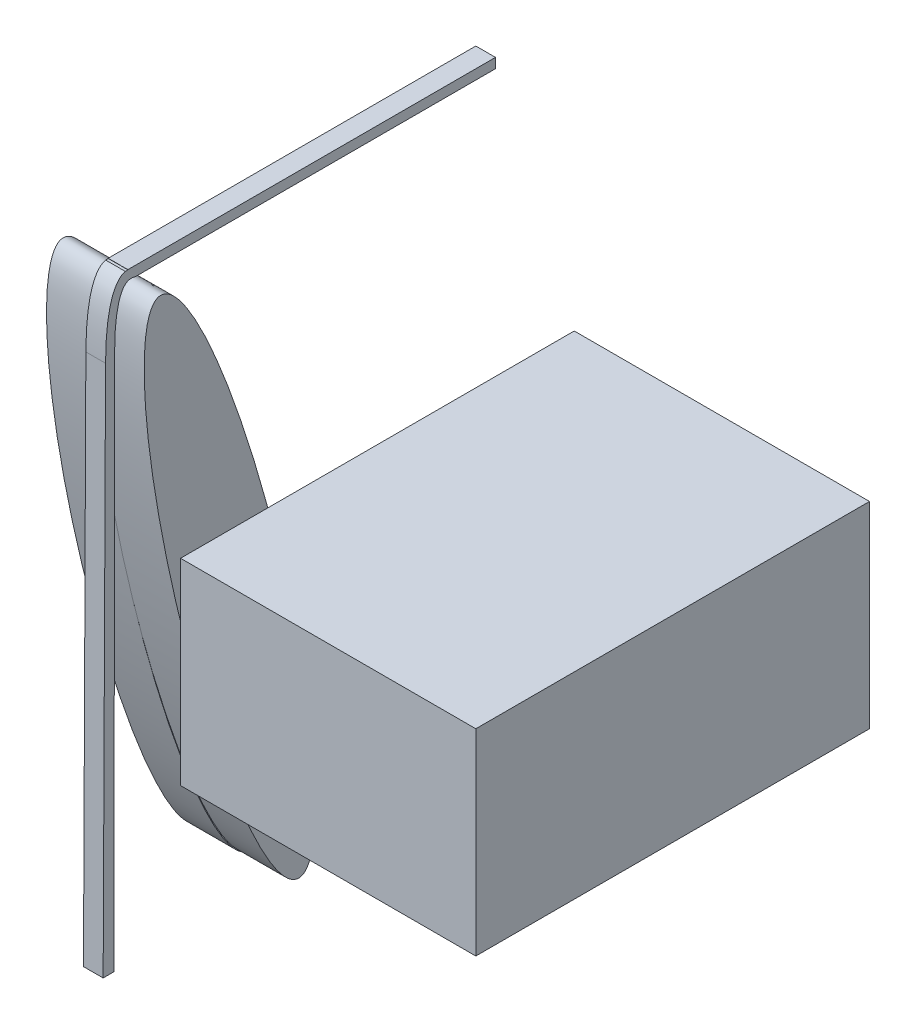
ISO-10303-21;
HEADER;
FILE_DESCRIPTION(('STEP AP214'),'2;1');
FILE_NAME('part.step','',(''),(''),'','','');
FILE_SCHEMA(('AUTOMOTIVE_DESIGN { 1 0 10303 214 1 1 1 1 }'));
ENDSEC;
DATA;
#1=APPLICATION_CONTEXT('core data for automotive mechanical design processes');
#2=APPLICATION_PROTOCOL_DEFINITION('international standard','automotive_design',2000,#1);
#3=PRODUCT_CONTEXT('',#1,'mechanical');
#4=PRODUCT('Part','Part','',(#3));
#5=PRODUCT_RELATED_PRODUCT_CATEGORY('part','',(#4));
#6=PRODUCT_DEFINITION_FORMATION('','',#4);
#7=PRODUCT_DEFINITION_CONTEXT('part definition',#1,'design');
#8=PRODUCT_DEFINITION('design','',#6,#7);
#9=PRODUCT_DEFINITION_SHAPE('','',#8);
#10=(LENGTH_UNIT() NAMED_UNIT(*) SI_UNIT(.MILLI.,.METRE.));
#11=(NAMED_UNIT(*) PLANE_ANGLE_UNIT() SI_UNIT($,.RADIAN.));
#12=(NAMED_UNIT(*) SI_UNIT($,.STERADIAN.) SOLID_ANGLE_UNIT());
#13=UNCERTAINTY_MEASURE_WITH_UNIT(LENGTH_MEASURE(1.E-05),#10,'distance_accuracy_value','');
#14=(GEOMETRIC_REPRESENTATION_CONTEXT(3) GLOBAL_UNCERTAINTY_ASSIGNED_CONTEXT((#13)) GLOBAL_UNIT_ASSIGNED_CONTEXT((#10,
#11,#12)) REPRESENTATION_CONTEXT('',''));
#15=CARTESIAN_POINT('',(0.,0.,0.));
#16=DIRECTION('',(0.,0.,1.));
#17=DIRECTION('',(1.,0.,0.));
#18=AXIS2_PLACEMENT_3D('',#15,#16,#17);
#19=CARTESIAN_POINT('',(-10.,10.,30.));
#20=DIRECTION('',(-1.,0.,0.));
#21=DIRECTION('',(0.,0.,1.));
#22=AXIS2_PLACEMENT_3D('',#19,#20,#21);
#23=PLANE('',#22);
#24=CARTESIAN_POINT('',(-10.,10.,30.));
#25=DIRECTION('',(-1.,0.,0.));
#26=DIRECTION('',(0.,-0.971398766942105,-0.237454070471235));
#27=AXIS2_PLACEMENT_3D('',#24,#25,#26);
#28=ELLIPSE('',#27,29.9945475637786,5.00002524983495);
#29=CARTESIAN_POINT('',(-10.,8.81272365196809,34.8570183623691));
#30=VERTEX_POINT('',#29);
#31=CARTESIAN_POINT('',(-10.,39.0746483582424,36.5030729096314));
#32=VERTEX_POINT('',#31);
#33=EDGE_CURVE('E11',#30,#32,#28,.T.);
#34=ORIENTED_EDGE('',*,*,#33,.F.);
#35=CARTESIAN_POINT('',(-10.,10.,30.));
#36=DIRECTION('',(-1.,0.,0.));
#37=DIRECTION('',(0.,0.970628381176253,0.240583760165074));
#38=AXIS2_PLACEMENT_3D('',#35,#36,#37);
#39=ELLIPSE('',#38,30.,5.);
#40=CARTESIAN_POINT('',(-10.,33.5140158510238,38.697434300692));
#41=VERTEX_POINT('',#40);
#42=EDGE_CURVE('E171',#30,#41,#39,.T.);
#43=ORIENTED_EDGE('',*,*,#42,.T.);
#44=DIRECTION('',(0.,-0.999999229372091,0.00124147300618938));
#45=VECTOR('',#44,1.);
#46=CARTESIAN_POINT('',(-10.,0.0480934448613429,38.7389879275843));
#47=LINE('',#46,#45);
#48=CARTESIAN_POINT('',(-10.,-21.,38.7651185875649));
#49=VERTEX_POINT('',#48);
#50=EDGE_CURVE('E188',#41,#49,#47,.T.);
#51=ORIENTED_EDGE('',*,*,#50,.T.);
#52=DIRECTION('',(0.,0.,1.));
#53=VECTOR('',#52,1.);
#54=CARTESIAN_POINT('',(-10.,-20.9999999999999,0.));
#55=LINE('',#54,#53);
#56=CARTESIAN_POINT('',(-10.,-21.,39.8624684707727));
#57=VERTEX_POINT('',#56);
#58=EDGE_CURVE('E409',#49,#57,#55,.T.);
#59=ORIENTED_EDGE('',*,*,#58,.T.);
#60=DIRECTION('',(0.,-0.999989834259744,0.00450903284201434));
#61=VECTOR('',#60,1.);
#62=CARTESIAN_POINT('',(-10.,0.179312393375753,39.7669692847997));
#63=LINE('',#62,#61);
#64=CARTESIAN_POINT('',(-10.,32.9672969363152,39.6191256827325));
#65=VERTEX_POINT('',#64);
#66=EDGE_CURVE('E405',#65,#57,#63,.T.);
#67=ORIENTED_EDGE('',*,*,#66,.F.);
#68=CARTESIAN_POINT('',(-10.,9.96074716305292,30.1584062384746));
#69=DIRECTION('',(-1.,0.,0.));
#70=DIRECTION('',(0.,0.970643196282759,0.240523981153624));
#71=AXIS2_PLACEMENT_3D('',#68,#69,#70);
#72=ELLIPSE('',#71,31.,6.);
#73=CARTESIAN_POINT('',(-10.,40.0506862478184,37.6146496542369));
#74=VERTEX_POINT('',#73);
#75=EDGE_CURVE('E402',#65,#74,#72,.T.);
#76=ORIENTED_EDGE('',*,*,#75,.T.);
#77=DIRECTION('',(0.,-0.000637041838274439,0.999999797088828));
#78=VECTOR('',#77,1.);
#79=CARTESIAN_POINT('',(-10.,40.0746320950563,0.025529222478171));
#80=LINE('',#79,#78);
#81=CARTESIAN_POINT('',(-10.,40.0508557961112,37.3485003244142));
#82=VERTEX_POINT('',#81);
#83=EDGE_CURVE('E197',#82,#74,#80,.T.);
#84=ORIENTED_EDGE('',*,*,#83,.F.);
#85=DIRECTION('',(0.,1.,0.));
#86=VECTOR('',#85,1.);
#87=CARTESIAN_POINT('',(-10.,0.,37.3485003244142));
#88=LINE('',#87,#86);
#89=CARTESIAN_POINT('',(-10.,40.0746483582424,37.3485003244142));
#90=VERTEX_POINT('',#89);
#91=EDGE_CURVE('E365',#82,#90,#88,.T.);
#92=ORIENTED_EDGE('',*,*,#91,.T.);
#93=DIRECTION('',(0.,0.,1.));
#94=VECTOR('',#93,1.);
#95=CARTESIAN_POINT('',(-10.,40.0746483582424,0.));
#96=LINE('',#95,#94);
#97=CARTESIAN_POINT('',(-10.,40.0746483582424,0.));
#98=VERTEX_POINT('',#97);
#99=EDGE_CURVE('E367',#98,#90,#96,.T.);
#100=ORIENTED_EDGE('',*,*,#99,.F.);
#101=DIRECTION('',(0.,1.,0.));
#102=VECTOR('',#101,1.);
#103=CARTESIAN_POINT('',(-10.,0.,0.));
#104=LINE('',#103,#102);
#105=CARTESIAN_POINT('',(-10.,39.0746483582424,0.));
#106=VERTEX_POINT('',#105);
#107=EDGE_CURVE('E334',#106,#98,#104,.T.);
#108=ORIENTED_EDGE('',*,*,#107,.F.);
#109=DIRECTION('',(0.,0.,-1.));
#110=VECTOR('',#109,1.);
#111=CARTESIAN_POINT('',(-10.,39.0746483582424,0.));
#112=LINE('',#111,#110);
#113=EDGE_CURVE('E62',#32,#106,#112,.T.);
#114=ORIENTED_EDGE('',*,*,#113,.F.);
#115=EDGE_LOOP('',(#34,#43,#51,#59,#67,#76,#84,#92,#100,#108,#114));
#116=FACE_BOUND('',#115,.T.);
#117=ADVANCED_FACE('F43',(#116),#23,.T.);
#118=CARTESIAN_POINT('',(-8.,0.,37.3485003244142));
#119=DIRECTION('',(0.,0.,1.));
#120=DIRECTION('',(1.,0.,0.));
#121=AXIS2_PLACEMENT_3D('',#118,#119,#120);
#122=PLANE('',#121);
#123=ORIENTED_EDGE('',*,*,#91,.F.);
#124=DIRECTION('',(1.,0.,0.));
#125=VECTOR('',#124,1.);
#126=CARTESIAN_POINT('',(-8.,40.0508557961112,37.3485003244142));
#127=LINE('',#126,#125);
#128=CARTESIAN_POINT('',(-8.,40.0508557961112,37.3485003244142));
#129=VERTEX_POINT('',#128);
#130=EDGE_CURVE('E375',#82,#129,#127,.T.);
#131=ORIENTED_EDGE('',*,*,#130,.T.);
#132=DIRECTION('',(0.,1.,0.));
#133=VECTOR('',#132,1.);
#134=CARTESIAN_POINT('',(-8.,0.,37.3485003244142));
#135=LINE('',#134,#133);
#136=CARTESIAN_POINT('',(-8.,40.0746483582424,37.3485003244142));
#137=VERTEX_POINT('',#136);
#138=EDGE_CURVE('E333',#129,#137,#135,.T.);
#139=ORIENTED_EDGE('',*,*,#138,.T.);
#140=DIRECTION('',(-1.,0.,0.));
#141=VECTOR('',#140,1.);
#142=CARTESIAN_POINT('',(-8.,40.0746483582424,37.3485003244142));
#143=LINE('',#142,#141);
#144=EDGE_CURVE('E343',#137,#90,#143,.T.);
#145=ORIENTED_EDGE('',*,*,#144,.T.);
#146=EDGE_LOOP('',(#123,#131,#139,#145));
#147=FACE_BOUND('',#146,.T.);
#148=ADVANCED_FACE('F244',(#147),#122,.T.);
#149=DIRECTION('',(1.,0.,0.));
#150=VECTOR('',#149,1.);
#151=SURFACE_OF_LINEAR_EXTRUSION('',#39,#150);
#152=CARTESIAN_POINT('',(-5.,10.,30.));
#153=DIRECTION('',(-1.,0.,0.));
#154=DIRECTION('',(0.,0.970628381176253,0.240583760165074));
#155=AXIS2_PLACEMENT_3D('',#152,#153,#154);
#156=ELLIPSE('',#155,30.,5.);
#157=CARTESIAN_POINT('',(-5.,39.1188514352876,37.2175128049522));
#158=VERTEX_POINT('',#157);
#159=EDGE_CURVE('E269',#158,#158,#156,.T.);
#160=ORIENTED_EDGE('',*,*,#159,.T.);
#161=EDGE_LOOP('',(#160));
#162=FACE_BOUND('',#161,.T.);
#163=DIRECTION('',(1.,0.,0.));
#164=VECTOR('',#163,1.);
#165=CARTESIAN_POINT('',(-10.,39.0746483582424,36.6403753439607));
#166=LINE('',#165,#164);
#167=CARTESIAN_POINT('',(-8.,39.0746483582424,36.6403753439607));
#168=VERTEX_POINT('',#167);
#169=CARTESIAN_POINT('',(-10.,39.0746483582424,36.6403753439607));
#170=VERTEX_POINT('',#169);
#171=EDGE_CURVE('E267',#168,#170,#166,.F.);
#172=ORIENTED_EDGE('',*,*,#171,.F.);
#173=CARTESIAN_POINT('',(-8.,10.,30.));
#174=DIRECTION('',(-1.,0.,0.));
#175=DIRECTION('',(0.,0.970628381176253,0.240583760165074));
#176=AXIS2_PLACEMENT_3D('',#173,#174,#175);
#177=ELLIPSE('',#176,30.,5.);
#178=CARTESIAN_POINT('',(-8.,33.5140158510238,38.697434300692));
#179=VERTEX_POINT('',#178);
#180=EDGE_CURVE('E47',#179,#168,#177,.T.);
#181=ORIENTED_EDGE('',*,*,#180,.F.);
#182=DIRECTION('',(-1.,0.,0.));
#183=VECTOR('',#182,1.);
#184=CARTESIAN_POINT('',(-8.,33.5140158510238,38.697434300692));
#185=LINE('',#184,#183);
#186=EDGE_CURVE('E379',#179,#41,#185,.T.);
#187=ORIENTED_EDGE('',*,*,#186,.T.);
#188=ORIENTED_EDGE('',*,*,#42,.F.);
#189=CARTESIAN_POINT('',(-10.,-19.1366665184612,22.8776725891206));
#190=VERTEX_POINT('',#189);
#191=EDGE_CURVE('E165',#190,#30,#39,.T.);
#192=ORIENTED_EDGE('',*,*,#191,.F.);
#193=CARTESIAN_POINT('',(-10.,11.1872763480319,25.1429816376309));
#194=VERTEX_POINT('',#193);
#195=EDGE_CURVE('E156',#194,#190,#39,.T.);
#196=ORIENTED_EDGE('',*,*,#195,.F.);
#197=EDGE_CURVE('E164',#170,#194,#39,.T.);
#198=ORIENTED_EDGE('',*,*,#197,.F.);
#199=EDGE_LOOP('',(#172,#181,#187,#188,#192,#196,#198));
#200=FACE_BOUND('',#199,.T.);
#201=ADVANCED_FACE('F169',(#162,#200),#151,.F.);
#202=CARTESIAN_POINT('',(0.,0.,40.));
#203=DIRECTION('',(1.,0.,0.));
#204=DIRECTION('',(0.,0.,-1.));
#205=AXIS2_PLACEMENT_3D('',#202,#203,#204);
#206=PLANE('',#205);
#207=CARTESIAN_POINT('',(0.,10.,30.));
#208=DIRECTION('',(1.,0.,0.));
#209=DIRECTION('',(0.,0.,-1.));
#210=AXIS2_PLACEMENT_3D('',#207,#208,#209);
#211=CIRCLE('',#210,2.);
#212=CARTESIAN_POINT('',(0.,10.,28.));
#213=VERTEX_POINT('',#212);
#214=EDGE_CURVE('E317',#213,#213,#211,.F.);
#215=ORIENTED_EDGE('',*,*,#214,.F.);
#216=EDGE_LOOP('',(#215));
#217=FACE_BOUND('',#216,.T.);
#218=DIRECTION('',(0.,-1.,0.));
#219=VECTOR('',#218,1.);
#220=CARTESIAN_POINT('',(0.,0.,0.));
#221=LINE('',#220,#219);
#222=CARTESIAN_POINT('',(0.,20.,0.));
#223=VERTEX_POINT('',#222);
#224=CARTESIAN_POINT('',(0.,0.,0.));
#225=VERTEX_POINT('',#224);
#226=EDGE_CURVE('E276',#223,#225,#221,.T.);
#227=ORIENTED_EDGE('',*,*,#226,.T.);
#228=DIRECTION('',(0.,0.,-1.));
#229=VECTOR('',#228,1.);
#230=CARTESIAN_POINT('',(0.,0.,40.));
#231=LINE('',#230,#229);
#232=CARTESIAN_POINT('',(0.,0.,40.));
#233=VERTEX_POINT('',#232);
#234=EDGE_CURVE('E314',#233,#225,#231,.T.);
#235=ORIENTED_EDGE('',*,*,#234,.F.);
#236=DIRECTION('',(0.,-1.,0.));
#237=VECTOR('',#236,1.);
#238=CARTESIAN_POINT('',(0.,0.,40.));
#239=LINE('',#238,#237);
#240=CARTESIAN_POINT('',(0.,20.,40.));
#241=VERTEX_POINT('',#240);
#242=EDGE_CURVE('E277',#241,#233,#239,.T.);
#243=ORIENTED_EDGE('',*,*,#242,.F.);
#244=DIRECTION('',(0.,0.,-1.));
#245=VECTOR('',#244,1.);
#246=CARTESIAN_POINT('',(0.,20.,40.));
#247=LINE('',#246,#245);
#248=EDGE_CURVE('E291',#241,#223,#247,.T.);
#249=ORIENTED_EDGE('',*,*,#248,.T.);
#250=EDGE_LOOP('',(#227,#235,#243,#249));
#251=FACE_BOUND('',#250,.T.);
#252=ADVANCED_FACE('F45',(#217,#251),#206,.F.);
#253=CARTESIAN_POINT('',(0.,0.,40.));
#254=DIRECTION('',(0.,1.,0.));
#255=DIRECTION('',(0.,0.,1.));
#256=AXIS2_PLACEMENT_3D('',#253,#254,#255);
#257=PLANE('',#256);
#258=DIRECTION('',(1.,0.,0.));
#259=VECTOR('',#258,1.);
#260=CARTESIAN_POINT('',(0.,0.,0.));
#261=LINE('',#260,#259);
#262=CARTESIAN_POINT('',(30.,0.,0.));
#263=VERTEX_POINT('',#262);
#264=EDGE_CURVE('E295',#225,#263,#261,.T.);
#265=ORIENTED_EDGE('',*,*,#264,.T.);
#266=DIRECTION('',(0.,0.,-1.));
#267=VECTOR('',#266,1.);
#268=CARTESIAN_POINT('',(30.,0.,40.));
#269=LINE('',#268,#267);
#270=CARTESIAN_POINT('',(30.,0.,40.));
#271=VERTEX_POINT('',#270);
#272=EDGE_CURVE('E310',#271,#263,#269,.T.);
#273=ORIENTED_EDGE('',*,*,#272,.F.);
#274=DIRECTION('',(1.,0.,0.));
#275=VECTOR('',#274,1.);
#276=CARTESIAN_POINT('',(0.,0.,40.));
#277=LINE('',#276,#275);
#278=EDGE_CURVE('E281',#233,#271,#277,.T.);
#279=ORIENTED_EDGE('',*,*,#278,.F.);
#280=ORIENTED_EDGE('',*,*,#234,.T.);
#281=EDGE_LOOP('',(#265,#273,#279,#280));
#282=FACE_BOUND('',#281,.T.);
#283=ADVANCED_FACE('F454',(#282),#257,.F.);
#284=CARTESIAN_POINT('',(30.,0.,40.));
#285=DIRECTION('',(-1.,0.,0.));
#286=DIRECTION('',(0.,0.,1.));
#287=AXIS2_PLACEMENT_3D('',#284,#285,#286);
#288=PLANE('',#287);
#289=DIRECTION('',(0.,1.,0.));
#290=VECTOR('',#289,1.);
#291=CARTESIAN_POINT('',(30.,0.,0.));
#292=LINE('',#291,#290);
#293=CARTESIAN_POINT('',(30.,20.,0.));
#294=VERTEX_POINT('',#293);
#295=EDGE_CURVE('E298',#263,#294,#292,.T.);
#296=ORIENTED_EDGE('',*,*,#295,.T.);
#297=DIRECTION('',(0.,0.,-1.));
#298=VECTOR('',#297,1.);
#299=CARTESIAN_POINT('',(30.,20.,40.));
#300=LINE('',#299,#298);
#301=CARTESIAN_POINT('',(30.,20.,40.));
#302=VERTEX_POINT('',#301);
#303=EDGE_CURVE('E306',#302,#294,#300,.T.);
#304=ORIENTED_EDGE('',*,*,#303,.F.);
#305=DIRECTION('',(0.,1.,0.));
#306=VECTOR('',#305,1.);
#307=CARTESIAN_POINT('',(30.,0.,40.));
#308=LINE('',#307,#306);
#309=EDGE_CURVE('E285',#271,#302,#308,.T.);
#310=ORIENTED_EDGE('',*,*,#309,.F.);
#311=ORIENTED_EDGE('',*,*,#272,.T.);
#312=EDGE_LOOP('',(#296,#304,#310,#311));
#313=FACE_BOUND('',#312,.T.);
#314=ADVANCED_FACE('F463',(#313),#288,.F.);
#315=CARTESIAN_POINT('',(0.,20.,40.));
#316=DIRECTION('',(0.,-1.,0.));
#317=DIRECTION('',(0.,0.,-1.));
#318=AXIS2_PLACEMENT_3D('',#315,#316,#317);
#319=PLANE('',#318);
#320=DIRECTION('',(-1.,0.,0.));
#321=VECTOR('',#320,1.);
#322=CARTESIAN_POINT('',(0.,20.,0.));
#323=LINE('',#322,#321);
#324=EDGE_CURVE('E282',#294,#223,#323,.T.);
#325=ORIENTED_EDGE('',*,*,#324,.T.);
#326=ORIENTED_EDGE('',*,*,#248,.F.);
#327=DIRECTION('',(-1.,0.,0.));
#328=VECTOR('',#327,1.);
#329=CARTESIAN_POINT('',(0.,20.,40.));
#330=LINE('',#329,#328);
#331=EDGE_CURVE('E288',#302,#241,#330,.T.);
#332=ORIENTED_EDGE('',*,*,#331,.F.);
#333=ORIENTED_EDGE('',*,*,#303,.T.);
#334=EDGE_LOOP('',(#325,#326,#332,#333));
#335=FACE_BOUND('',#334,.T.);
#336=ADVANCED_FACE('F471',(#335),#319,.F.);
#337=CARTESIAN_POINT('',(0.,0.,40.));
#338=DIRECTION('',(0.,0.,-1.));
#339=DIRECTION('',(-1.,0.,0.));
#340=AXIS2_PLACEMENT_3D('',#337,#338,#339);
#341=PLANE('',#340);
#342=ORIENTED_EDGE('',*,*,#242,.T.);
#343=ORIENTED_EDGE('',*,*,#278,.T.);
#344=ORIENTED_EDGE('',*,*,#309,.T.);
#345=ORIENTED_EDGE('',*,*,#331,.T.);
#346=EDGE_LOOP('',(#342,#343,#344,#345));
#347=FACE_BOUND('',#346,.T.);
#348=ADVANCED_FACE('F478',(#347),#341,.F.);
#349=CARTESIAN_POINT('',(0.,0.,0.));
#350=DIRECTION('',(0.,0.,-1.));
#351=DIRECTION('',(-1.,0.,0.));
#352=AXIS2_PLACEMENT_3D('',#349,#350,#351);
#353=PLANE('',#352);
#354=ORIENTED_EDGE('',*,*,#226,.F.);
#355=ORIENTED_EDGE('',*,*,#324,.F.);
#356=ORIENTED_EDGE('',*,*,#295,.F.);
#357=ORIENTED_EDGE('',*,*,#264,.F.);
#358=EDGE_LOOP('',(#354,#355,#356,#357));
#359=FACE_BOUND('',#358,.T.);
#360=ADVANCED_FACE('F485',(#359),#353,.T.);
#361=CARTESIAN_POINT('',(-5.,10.,30.));
#362=DIRECTION('',(1.,0.,0.));
#363=DIRECTION('',(0.,0.,-1.));
#364=AXIS2_PLACEMENT_3D('',#361,#362,#363);
#365=CYLINDRICAL_SURFACE('',#364,2.);
#366=CARTESIAN_POINT('',(-5.,10.,30.));
#367=DIRECTION('',(-1.,0.,0.));
#368=DIRECTION('',(0.,0.,1.));
#369=AXIS2_PLACEMENT_3D('',#366,#367,#368);
#370=CIRCLE('',#369,2.);
#371=CARTESIAN_POINT('',(-5.,10.,32.));
#372=VERTEX_POINT('',#371);
#373=EDGE_CURVE('E266',#372,#372,#370,.T.);
#374=ORIENTED_EDGE('',*,*,#373,.F.);
#375=EDGE_LOOP('',(#374));
#376=FACE_BOUND('',#375,.T.);
#377=ORIENTED_EDGE('',*,*,#214,.T.);
#378=EDGE_LOOP('',(#377));
#379=FACE_BOUND('',#378,.T.);
#380=ADVANCED_FACE('F254',(#376,#379),#365,.T.);
#381=EDGE_CURVE('E53',#194,#190,#28,.T.);
#382=ORIENTED_EDGE('',*,*,#381,.F.);
#383=ORIENTED_EDGE('',*,*,#195,.T.);
#384=EDGE_LOOP('',(#382,#383));
#385=FACE_BOUND('',#384,.T.);
#386=ADVANCED_FACE('F158',(#385),#23,.T.);
#387=CARTESIAN_POINT('',(-5.,10.,30.));
#388=DIRECTION('',(-1.,0.,0.));
#389=DIRECTION('',(0.,0.,1.));
#390=AXIS2_PLACEMENT_3D('',#387,#388,#389);
#391=PLANE('',#390);
#392=ORIENTED_EDGE('',*,*,#373,.T.);
#393=EDGE_LOOP('',(#392));
#394=FACE_BOUND('',#393,.T.);
#395=ORIENTED_EDGE('',*,*,#159,.F.);
#396=EDGE_LOOP('',(#395));
#397=FACE_BOUND('',#396,.T.);
#398=ADVANCED_FACE('F250',(#394,#397),#391,.F.);
#399=CARTESIAN_POINT('',(-8.,39.0746483582424,0.));
#400=DIRECTION('',(0.,1.,0.));
#401=DIRECTION('',(0.,0.,1.));
#402=AXIS2_PLACEMENT_3D('',#399,#400,#401);
#403=PLANE('',#402);
#404=DIRECTION('',(0.,0.,-1.));
#405=VECTOR('',#404,1.);
#406=CARTESIAN_POINT('',(-8.,39.0746483582424,0.));
#407=LINE('',#406,#405);
#408=CARTESIAN_POINT('',(-8.,39.0746483582424,0.));
#409=VERTEX_POINT('',#408);
#410=EDGE_CURVE('E325',#168,#409,#407,.T.);
#411=ORIENTED_EDGE('',*,*,#410,.F.);
#412=ORIENTED_EDGE('',*,*,#171,.T.);
#413=EDGE_CURVE('E362',#170,#32,#112,.T.);
#414=ORIENTED_EDGE('',*,*,#413,.T.);
#415=ORIENTED_EDGE('',*,*,#113,.T.);
#416=DIRECTION('',(-1.,0.,0.));
#417=VECTOR('',#416,1.);
#418=CARTESIAN_POINT('',(-8.,39.0746483582424,0.));
#419=LINE('',#418,#417);
#420=EDGE_CURVE('E331',#409,#106,#419,.T.);
#421=ORIENTED_EDGE('',*,*,#420,.F.);
#422=EDGE_LOOP('',(#411,#412,#414,#415,#421));
#423=FACE_BOUND('',#422,.T.);
#424=ADVANCED_FACE('F239',(#423),#403,.F.);
#425=CARTESIAN_POINT('',(-8.,0.,0.));
#426=DIRECTION('',(0.,0.,1.));
#427=DIRECTION('',(1.,0.,0.));
#428=AXIS2_PLACEMENT_3D('',#425,#426,#427);
#429=PLANE('',#428);
#430=ORIENTED_EDGE('',*,*,#107,.T.);
#431=DIRECTION('',(-1.,0.,0.));
#432=VECTOR('',#431,1.);
#433=CARTESIAN_POINT('',(-8.,40.0746483582424,0.));
#434=LINE('',#433,#432);
#435=CARTESIAN_POINT('',(-8.,40.0746483582424,0.));
#436=VERTEX_POINT('',#435);
#437=EDGE_CURVE('E339',#436,#98,#434,.T.);
#438=ORIENTED_EDGE('',*,*,#437,.F.);
#439=DIRECTION('',(0.,1.,0.));
#440=VECTOR('',#439,1.);
#441=CARTESIAN_POINT('',(-8.,0.,0.));
#442=LINE('',#441,#440);
#443=EDGE_CURVE('E349',#409,#436,#442,.T.);
#444=ORIENTED_EDGE('',*,*,#443,.F.);
#445=ORIENTED_EDGE('',*,*,#420,.T.);
#446=EDGE_LOOP('',(#430,#438,#444,#445));
#447=FACE_BOUND('',#446,.T.);
#448=ADVANCED_FACE('F236',(#447),#429,.F.);
#449=CARTESIAN_POINT('',(-8.,40.0746483582424,0.));
#450=DIRECTION('',(0.,-1.,0.));
#451=DIRECTION('',(0.,0.,-1.));
#452=AXIS2_PLACEMENT_3D('',#449,#450,#451);
#453=PLANE('',#452);
#454=ORIENTED_EDGE('',*,*,#99,.T.);
#455=ORIENTED_EDGE('',*,*,#144,.F.);
#456=DIRECTION('',(0.,0.,1.));
#457=VECTOR('',#456,1.);
#458=CARTESIAN_POINT('',(-8.,40.0746483582424,0.));
#459=LINE('',#458,#457);
#460=EDGE_CURVE('E354',#436,#137,#459,.T.);
#461=ORIENTED_EDGE('',*,*,#460,.F.);
#462=ORIENTED_EDGE('',*,*,#437,.T.);
#463=EDGE_LOOP('',(#454,#455,#461,#462));
#464=FACE_BOUND('',#463,.T.);
#465=ADVANCED_FACE('F234',(#464),#453,.F.);
#466=CARTESIAN_POINT('',(-8.,0.,0.));
#467=DIRECTION('',(-1.,0.,0.));
#468=DIRECTION('',(0.,0.,1.));
#469=AXIS2_PLACEMENT_3D('',#466,#467,#468);
#470=PLANE('',#469);
#471=ORIENTED_EDGE('',*,*,#443,.T.);
#472=ORIENTED_EDGE('',*,*,#460,.T.);
#473=ORIENTED_EDGE('',*,*,#138,.F.);
#474=DIRECTION('',(0.,-0.000637041838274439,0.999999797088828));
#475=VECTOR('',#474,1.);
#476=CARTESIAN_POINT('',(-8.,40.0746320950563,0.025529222478171));
#477=LINE('',#476,#475);
#478=CARTESIAN_POINT('',(-8.,40.0506862478184,37.6146496542369));
#479=VERTEX_POINT('',#478);
#480=EDGE_CURVE('E209',#129,#479,#477,.T.);
#481=ORIENTED_EDGE('',*,*,#480,.T.);
#482=CARTESIAN_POINT('',(-8.,9.96074716305292,30.1584062384746));
#483=DIRECTION('',(-1.,0.,0.));
#484=DIRECTION('',(0.,0.970643196282759,0.240523981153624));
#485=AXIS2_PLACEMENT_3D('',#482,#483,#484);
#486=ELLIPSE('',#485,31.,6.);
#487=CARTESIAN_POINT('',(-8.,32.9672969363152,39.6191256827325));
#488=VERTEX_POINT('',#487);
#489=EDGE_CURVE('E204',#488,#479,#486,.T.);
#490=ORIENTED_EDGE('',*,*,#489,.F.);
#491=DIRECTION('',(0.,-0.999989834259744,0.00450903284201434));
#492=VECTOR('',#491,1.);
#493=CARTESIAN_POINT('',(-8.,0.179312393375753,39.7669692847997));
#494=LINE('',#493,#492);
#495=CARTESIAN_POINT('',(-8.,-21.,39.8624684707727));
#496=VERTEX_POINT('',#495);
#497=EDGE_CURVE('E201',#488,#496,#494,.T.);
#498=ORIENTED_EDGE('',*,*,#497,.T.);
#499=DIRECTION('',(0.,0.,1.));
#500=VECTOR('',#499,1.);
#501=CARTESIAN_POINT('',(-8.,-20.9999999999999,0.));
#502=LINE('',#501,#500);
#503=CARTESIAN_POINT('',(-8.,-21.,38.7651185875649));
#504=VERTEX_POINT('',#503);
#505=EDGE_CURVE('E196',#504,#496,#502,.T.);
#506=ORIENTED_EDGE('',*,*,#505,.F.);
#507=DIRECTION('',(0.,-0.999999229372091,0.00124147300618938));
#508=VECTOR('',#507,1.);
#509=CARTESIAN_POINT('',(-8.,0.0480934448613429,38.7389879275843));
#510=LINE('',#509,#508);
#511=EDGE_CURVE('E192',#179,#504,#510,.T.);
#512=ORIENTED_EDGE('',*,*,#511,.F.);
#513=ORIENTED_EDGE('',*,*,#180,.T.);
#514=ORIENTED_EDGE('',*,*,#410,.T.);
#515=EDGE_LOOP('',(#471,#472,#473,#481,#490,#498,#506,#512,#513,#514));
#516=FACE_BOUND('',#515,.T.);
#517=ADVANCED_FACE('F230',(#516),#470,.F.);
#518=CARTESIAN_POINT('',(-8.,0.0480934448613429,38.7389879275843));
#519=DIRECTION('',(0.,-0.00124147300618938,-0.99999922937209));
#520=DIRECTION('',(0.,0.999999229372091,-0.00124147300618938));
#521=AXIS2_PLACEMENT_3D('',#518,#519,#520);
#522=PLANE('',#521);
#523=ORIENTED_EDGE('',*,*,#50,.F.);
#524=ORIENTED_EDGE('',*,*,#186,.F.);
#525=ORIENTED_EDGE('',*,*,#511,.T.);
#526=DIRECTION('',(-1.,0.,0.));
#527=VECTOR('',#526,1.);
#528=CARTESIAN_POINT('',(-8.,-21.,38.7651185875649));
#529=LINE('',#528,#527);
#530=EDGE_CURVE('E385',#504,#49,#529,.T.);
#531=ORIENTED_EDGE('',*,*,#530,.T.);
#532=EDGE_LOOP('',(#523,#524,#525,#531));
#533=FACE_BOUND('',#532,.T.);
#534=ADVANCED_FACE('F227',(#533),#522,.T.);
#535=CARTESIAN_POINT('',(-8.,40.0746320950563,0.025529222478171));
#536=DIRECTION('',(0.,-0.999999797088828,-0.000637041838274439));
#537=DIRECTION('',(0.,0.000637041838274439,-0.999999797088828));
#538=AXIS2_PLACEMENT_3D('',#535,#536,#537);
#539=PLANE('',#538);
#540=ORIENTED_EDGE('',*,*,#130,.F.);
#541=ORIENTED_EDGE('',*,*,#83,.T.);
#542=DIRECTION('',(-1.,0.,0.));
#543=VECTOR('',#542,1.);
#544=CARTESIAN_POINT('',(-8.,40.0506862478184,37.6146496542369));
#545=LINE('',#544,#543);
#546=EDGE_CURVE('E394',#479,#74,#545,.T.);
#547=ORIENTED_EDGE('',*,*,#546,.F.);
#548=ORIENTED_EDGE('',*,*,#480,.F.);
#549=EDGE_LOOP('',(#540,#541,#547,#548));
#550=FACE_BOUND('',#549,.T.);
#551=ADVANCED_FACE('F217',(#550),#539,.F.);
#552=DIRECTION('',(-1.,0.,0.));
#553=VECTOR('',#552,1.);
#554=SURFACE_OF_LINEAR_EXTRUSION('',#486,#553);
#555=ORIENTED_EDGE('',*,*,#75,.F.);
#556=DIRECTION('',(-1.,0.,0.));
#557=VECTOR('',#556,1.);
#558=CARTESIAN_POINT('',(-8.,32.9672969363152,39.6191256827325));
#559=LINE('',#558,#557);
#560=EDGE_CURVE('E391',#488,#65,#559,.T.);
#561=ORIENTED_EDGE('',*,*,#560,.F.);
#562=ORIENTED_EDGE('',*,*,#489,.T.);
#563=ORIENTED_EDGE('',*,*,#546,.T.);
#564=EDGE_LOOP('',(#555,#561,#562,#563));
#565=FACE_BOUND('',#564,.T.);
#566=ADVANCED_FACE('F212',(#565),#554,.T.);
#567=CARTESIAN_POINT('',(-8.,0.179312393375753,39.7669692847997));
#568=DIRECTION('',(0.,-0.00450903284201434,-0.999989834259744));
#569=DIRECTION('',(0.,0.999989834259744,-0.00450903284201434));
#570=AXIS2_PLACEMENT_3D('',#567,#568,#569);
#571=PLANE('',#570);
#572=ORIENTED_EDGE('',*,*,#66,.T.);
#573=DIRECTION('',(-1.,0.,0.));
#574=VECTOR('',#573,1.);
#575=CARTESIAN_POINT('',(-8.,-21.,39.8624684707727));
#576=LINE('',#575,#574);
#577=EDGE_CURVE('E388',#496,#57,#576,.T.);
#578=ORIENTED_EDGE('',*,*,#577,.F.);
#579=ORIENTED_EDGE('',*,*,#497,.F.);
#580=ORIENTED_EDGE('',*,*,#560,.T.);
#581=EDGE_LOOP('',(#572,#578,#579,#580));
#582=FACE_BOUND('',#581,.T.);
#583=ADVANCED_FACE('F216',(#582),#571,.F.);
#584=CARTESIAN_POINT('',(-8.,-20.9999999999999,0.));
#585=DIRECTION('',(0.,-1.,0.));
#586=DIRECTION('',(0.,0.,-1.));
#587=AXIS2_PLACEMENT_3D('',#584,#585,#586);
#588=PLANE('',#587);
#589=ORIENTED_EDGE('',*,*,#58,.F.);
#590=ORIENTED_EDGE('',*,*,#530,.F.);
#591=ORIENTED_EDGE('',*,*,#505,.T.);
#592=ORIENTED_EDGE('',*,*,#577,.T.);
#593=EDGE_LOOP('',(#589,#590,#591,#592));
#594=FACE_BOUND('',#593,.T.);
#595=ADVANCED_FACE('F222',(#594),#588,.T.);
#596=CARTESIAN_POINT('',(-10.,10.,30.));
#597=DIRECTION('',(-1.,0.,0.));
#598=DIRECTION('',(0.,0.,1.));
#599=AXIS2_PLACEMENT_3D('',#596,#597,#598);
#600=PLANE('',#599);
#601=EDGE_CURVE('E179',#190,#30,#28,.T.);
#602=ORIENTED_EDGE('',*,*,#601,.F.);
#603=ORIENTED_EDGE('',*,*,#191,.T.);
#604=EDGE_LOOP('',(#602,#603));
#605=FACE_BOUND('',#604,.T.);
#606=ADVANCED_FACE('F182',(#605),#600,.F.);
#607=ORIENTED_EDGE('',*,*,#413,.F.);
#608=ORIENTED_EDGE('',*,*,#197,.T.);
#609=EDGE_CURVE('E55',#32,#194,#28,.T.);
#610=ORIENTED_EDGE('',*,*,#609,.F.);
#611=EDGE_LOOP('',(#607,#608,#610));
#612=FACE_BOUND('',#611,.T.);
#613=ADVANCED_FACE('F423',(#612),#600,.F.);
#614=CARTESIAN_POINT('',(-15.,10.,30.));
#615=DIRECTION('',(-1.,0.,0.));
#616=DIRECTION('',(0.,-0.971398766942105,-0.237454070471235));
#617=AXIS2_PLACEMENT_3D('',#614,#615,#616);
#618=ELLIPSE('',#617,29.9945475637786,5.00002524983495);
#619=DIRECTION('',(1.,0.,0.));
#620=VECTOR('',#619,1.);
#621=SURFACE_OF_LINEAR_EXTRUSION('',#618,#620);
#622=CARTESIAN_POINT('',(-15.,-19.1366665184409,22.8776725890377));
#623=VERTEX_POINT('',#622);
#624=EDGE_CURVE('E184',#623,#623,#618,.T.);
#625=ORIENTED_EDGE('',*,*,#624,.F.);
#626=EDGE_LOOP('',(#625));
#627=FACE_BOUND('',#626,.T.);
#628=ORIENTED_EDGE('',*,*,#601,.T.);
#629=ORIENTED_EDGE('',*,*,#33,.T.);
#630=ORIENTED_EDGE('',*,*,#609,.T.);
#631=ORIENTED_EDGE('',*,*,#381,.T.);
#632=EDGE_LOOP('',(#628,#629,#630,#631));
#633=FACE_BOUND('',#632,.T.);
#634=ADVANCED_FACE('F178',(#627,#633),#621,.F.);
#635=CARTESIAN_POINT('',(-15.,10.,30.));
#636=DIRECTION('',(-1.,0.,0.));
#637=DIRECTION('',(0.,0.,1.));
#638=AXIS2_PLACEMENT_3D('',#635,#636,#637);
#639=PLANE('',#638);
#640=ORIENTED_EDGE('',*,*,#624,.T.);
#641=EDGE_LOOP('',(#640));
#642=FACE_BOUND('',#641,.T.);
#643=ADVANCED_FACE('F430',(#642),#639,.T.);
#644=CLOSED_SHELL('',(#117,#148,#201,#252,#283,#314,#336,#348,#360,#380,#386,#398,#424,#448,
#465,#517,#534,#551,#566,#583,#595,#606,#613,#634,#643));
#645=MANIFOLD_SOLID_BREP('B2',#644);
#646=ADVANCED_BREP_SHAPE_REPRESENTATION('',(#18,#645),#14);
#647=SHAPE_DEFINITION_REPRESENTATION(#9,#646);
ENDSEC;
END-ISO-10303-21;
